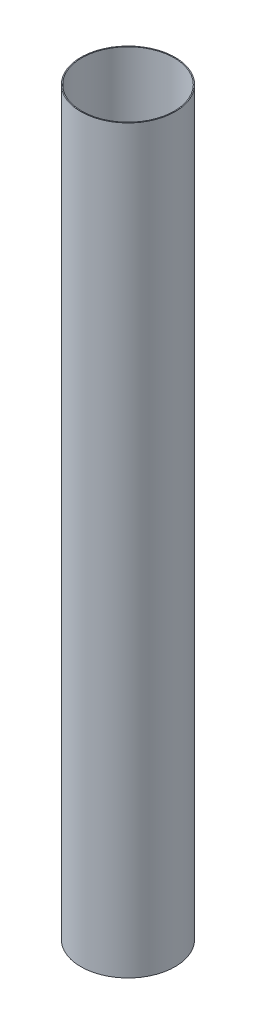
ISO-10303-21;
HEADER;
FILE_DESCRIPTION(('STEP AP214'),'2;1');
FILE_NAME('part.step','',(''),(''),'','','');
FILE_SCHEMA(('AUTOMOTIVE_DESIGN { 1 0 10303 214 1 1 1 1 }'));
ENDSEC;
DATA;
#1=APPLICATION_CONTEXT('core data for automotive mechanical design processes');
#2=APPLICATION_PROTOCOL_DEFINITION('international standard','automotive_design',2000,#1);
#3=PRODUCT_CONTEXT('',#1,'mechanical');
#4=PRODUCT('Part','Part','',(#3));
#5=PRODUCT_RELATED_PRODUCT_CATEGORY('part','',(#4));
#6=PRODUCT_DEFINITION_FORMATION('','',#4);
#7=PRODUCT_DEFINITION_CONTEXT('part definition',#1,'design');
#8=PRODUCT_DEFINITION('design','',#6,#7);
#9=PRODUCT_DEFINITION_SHAPE('','',#8);
#10=(LENGTH_UNIT() NAMED_UNIT(*) SI_UNIT(.MILLI.,.METRE.));
#11=(NAMED_UNIT(*) PLANE_ANGLE_UNIT() SI_UNIT($,.RADIAN.));
#12=(NAMED_UNIT(*) SI_UNIT($,.STERADIAN.) SOLID_ANGLE_UNIT());
#13=UNCERTAINTY_MEASURE_WITH_UNIT(LENGTH_MEASURE(1.E-05),#10,'distance_accuracy_value','');
#14=(GEOMETRIC_REPRESENTATION_CONTEXT(3) GLOBAL_UNCERTAINTY_ASSIGNED_CONTEXT((#13)) GLOBAL_UNIT_ASSIGNED_CONTEXT((#10,
#11,#12)) REPRESENTATION_CONTEXT('',''));
#15=CARTESIAN_POINT('',(0.,0.,0.));
#16=DIRECTION('',(0.,0.,1.));
#17=DIRECTION('',(1.,0.,0.));
#18=AXIS2_PLACEMENT_3D('',#15,#16,#17);
#19=CARTESIAN_POINT('',(0.,1524.,0.));
#20=DIRECTION('',(0.,1.,0.));
#21=DIRECTION('',(0.,0.,1.));
#22=AXIS2_PLACEMENT_3D('',#19,#20,#21);
#23=PLANE('',#22);
#24=CARTESIAN_POINT('',(0.,1524.,0.));
#25=DIRECTION('',(0.,1.,0.));
#26=DIRECTION('',(0.,0.,1.));
#27=AXIS2_PLACEMENT_3D('',#24,#25,#26);
#28=CIRCLE('',#27,97.028);
#29=CARTESIAN_POINT('',(0.,1524.,97.028));
#30=VERTEX_POINT('',#29);
#31=EDGE_CURVE('E10',#30,#30,#28,.T.);
#32=ORIENTED_EDGE('',*,*,#31,.T.);
#33=EDGE_LOOP('',(#32));
#34=FACE_BOUND('',#33,.T.);
#35=CARTESIAN_POINT('',(0.,1524.,0.));
#36=DIRECTION('',(0.,1.,0.));
#37=DIRECTION('',(0.,0.,1.));
#38=AXIS2_PLACEMENT_3D('',#35,#36,#37);
#39=CIRCLE('',#38,95.123);
#40=CARTESIAN_POINT('',(0.,1524.,95.123));
#41=VERTEX_POINT('',#40);
#42=EDGE_CURVE('E42',#41,#41,#39,.T.);
#43=ORIENTED_EDGE('',*,*,#42,.F.);
#44=EDGE_LOOP('',(#43));
#45=FACE_BOUND('',#44,.T.);
#46=ADVANCED_FACE('F31',(#34,#45),#23,.T.);
#47=CARTESIAN_POINT('',(0.,0.,0.));
#48=DIRECTION('',(0.,1.,0.));
#49=DIRECTION('',(0.,0.,1.));
#50=AXIS2_PLACEMENT_3D('',#47,#48,#49);
#51=PLANE('',#50);
#52=CARTESIAN_POINT('',(0.,0.,0.));
#53=DIRECTION('',(0.,1.,0.));
#54=DIRECTION('',(0.,0.,1.));
#55=AXIS2_PLACEMENT_3D('',#52,#53,#54);
#56=CIRCLE('',#55,97.028);
#57=CARTESIAN_POINT('',(0.,0.,97.028));
#58=VERTEX_POINT('',#57);
#59=EDGE_CURVE('E35',#58,#58,#56,.T.);
#60=ORIENTED_EDGE('',*,*,#59,.F.);
#61=EDGE_LOOP('',(#60));
#62=FACE_BOUND('',#61,.T.);
#63=CARTESIAN_POINT('',(0.,0.,0.));
#64=DIRECTION('',(0.,1.,0.));
#65=DIRECTION('',(0.,0.,1.));
#66=AXIS2_PLACEMENT_3D('',#63,#64,#65);
#67=CIRCLE('',#66,95.123);
#68=CARTESIAN_POINT('',(0.,0.,95.123));
#69=VERTEX_POINT('',#68);
#70=EDGE_CURVE('E44',#69,#69,#67,.T.);
#71=ORIENTED_EDGE('',*,*,#70,.T.);
#72=EDGE_LOOP('',(#71));
#73=FACE_BOUND('',#72,.T.);
#74=ADVANCED_FACE('F54',(#62,#73),#51,.F.);
#75=CARTESIAN_POINT('',(0.,1524.,0.));
#76=DIRECTION('',(0.,-1.,0.));
#77=DIRECTION('',(0.,0.,-1.));
#78=AXIS2_PLACEMENT_3D('',#75,#76,#77);
#79=CYLINDRICAL_SURFACE('',#78,97.028);
#80=ORIENTED_EDGE('',*,*,#31,.F.);
#81=EDGE_LOOP('',(#80));
#82=FACE_BOUND('',#81,.T.);
#83=ORIENTED_EDGE('',*,*,#59,.T.);
#84=EDGE_LOOP('',(#83));
#85=FACE_BOUND('',#84,.T.);
#86=ADVANCED_FACE('F33',(#82,#85),#79,.T.);
#87=CARTESIAN_POINT('',(0.,1524.,0.));
#88=DIRECTION('',(0.,-1.,0.));
#89=DIRECTION('',(0.,0.,-1.));
#90=AXIS2_PLACEMENT_3D('',#87,#88,#89);
#91=CYLINDRICAL_SURFACE('',#90,95.123);
#92=ORIENTED_EDGE('',*,*,#42,.T.);
#93=EDGE_LOOP('',(#92));
#94=FACE_BOUND('',#93,.T.);
#95=ORIENTED_EDGE('',*,*,#70,.F.);
#96=EDGE_LOOP('',(#95));
#97=FACE_BOUND('',#96,.T.);
#98=ADVANCED_FACE('F50',(#94,#97),#91,.F.);
#99=CLOSED_SHELL('',(#46,#74,#86,#98));
#100=MANIFOLD_SOLID_BREP('B2',#99);
#101=ADVANCED_BREP_SHAPE_REPRESENTATION('',(#18,#100),#14);
#102=SHAPE_DEFINITION_REPRESENTATION(#9,#101);
ENDSEC;
END-ISO-10303-21;
